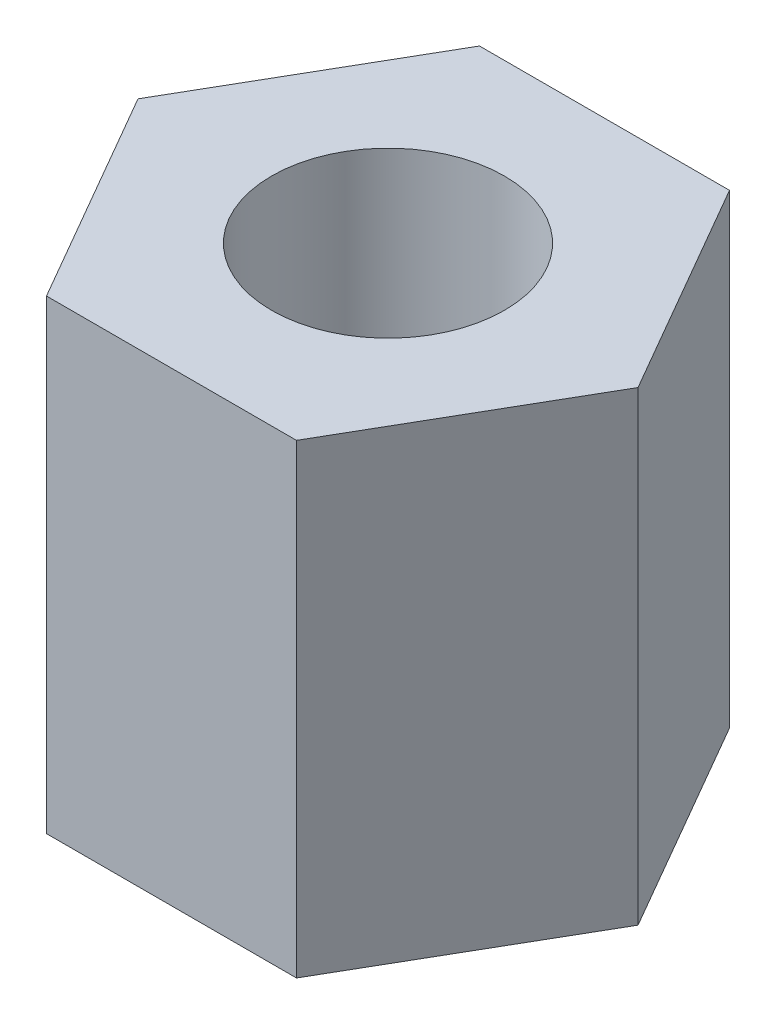
ISO-10303-21;
HEADER;
FILE_DESCRIPTION(('STEP AP214'),'2;1');
FILE_NAME('part.step','',(''),(''),'','','');
FILE_SCHEMA(('AUTOMOTIVE_DESIGN { 1 0 10303 214 1 1 1 1 }'));
ENDSEC;
DATA;
#1=APPLICATION_CONTEXT('core data for automotive mechanical design processes');
#2=APPLICATION_PROTOCOL_DEFINITION('international standard','automotive_design',2000,#1);
#3=PRODUCT_CONTEXT('',#1,'mechanical');
#4=PRODUCT('Part','Part','',(#3));
#5=PRODUCT_RELATED_PRODUCT_CATEGORY('part','',(#4));
#6=PRODUCT_DEFINITION_FORMATION('','',#4);
#7=PRODUCT_DEFINITION_CONTEXT('part definition',#1,'design');
#8=PRODUCT_DEFINITION('design','',#6,#7);
#9=PRODUCT_DEFINITION_SHAPE('','',#8);
#10=(LENGTH_UNIT() NAMED_UNIT(*) SI_UNIT(.MILLI.,.METRE.));
#11=(NAMED_UNIT(*) PLANE_ANGLE_UNIT() SI_UNIT($,.RADIAN.));
#12=(NAMED_UNIT(*) SI_UNIT($,.STERADIAN.) SOLID_ANGLE_UNIT());
#13=UNCERTAINTY_MEASURE_WITH_UNIT(LENGTH_MEASURE(1.E-05),#10,'distance_accuracy_value','');
#14=(GEOMETRIC_REPRESENTATION_CONTEXT(3) GLOBAL_UNCERTAINTY_ASSIGNED_CONTEXT((#13)) GLOBAL_UNIT_ASSIGNED_CONTEXT((#10,
#11,#12)) REPRESENTATION_CONTEXT('',''));
#15=CARTESIAN_POINT('',(0.,0.,0.));
#16=DIRECTION('',(0.,0.,1.));
#17=DIRECTION('',(1.,0.,0.));
#18=AXIS2_PLACEMENT_3D('',#15,#16,#17);
#19=CARTESIAN_POINT('',(1.34233937586591,2.5,2.32499999999999));
#20=DIRECTION('',(-0.866025403784442,0.,-0.499999999999995));
#21=DIRECTION('',(-0.499999999999995,0.,0.866025403784442));
#22=AXIS2_PLACEMENT_3D('',#19,#20,#21);
#23=PLANE('',#22);
#24=DIRECTION('',(0.499999999999995,0.,-0.866025403784442));
#25=VECTOR('',#24,1.);
#26=CARTESIAN_POINT('',(1.34233937586591,-2.5,2.32499999999999));
#27=LINE('',#26,#25);
#28=CARTESIAN_POINT('',(1.34233937586591,-2.5,2.32499999999999));
#29=VERTEX_POINT('',#28);
#30=CARTESIAN_POINT('',(2.68467875173176,-2.5,0.));
#31=VERTEX_POINT('',#30);
#32=EDGE_CURVE('E119',#29,#31,#27,.T.);
#33=ORIENTED_EDGE('',*,*,#32,.T.);
#34=DIRECTION('',(0.,-1.,0.));
#35=VECTOR('',#34,1.);
#36=CARTESIAN_POINT('',(2.68467875173176,2.5,0.));
#37=LINE('',#36,#35);
#38=CARTESIAN_POINT('',(2.68467875173176,2.5,0.));
#39=VERTEX_POINT('',#38);
#40=EDGE_CURVE('E11',#39,#31,#37,.T.);
#41=ORIENTED_EDGE('',*,*,#40,.F.);
#42=DIRECTION('',(0.499999999999995,0.,-0.866025403784442));
#43=VECTOR('',#42,1.);
#44=CARTESIAN_POINT('',(1.34233937586591,2.5,2.32499999999999));
#45=LINE('',#44,#43);
#46=CARTESIAN_POINT('',(1.34233937586591,2.5,2.32499999999999));
#47=VERTEX_POINT('',#46);
#48=EDGE_CURVE('E130',#47,#39,#45,.T.);
#49=ORIENTED_EDGE('',*,*,#48,.F.);
#50=DIRECTION('',(0.,-1.,0.));
#51=VECTOR('',#50,1.);
#52=CARTESIAN_POINT('',(1.34233937586591,2.5,2.32499999999999));
#53=LINE('',#52,#51);
#54=EDGE_CURVE('E115',#47,#29,#53,.T.);
#55=ORIENTED_EDGE('',*,*,#54,.T.);
#56=EDGE_LOOP('',(#33,#41,#49,#55));
#57=FACE_BOUND('',#56,.T.);
#58=ADVANCED_FACE('F35',(#57),#23,.F.);
#59=CARTESIAN_POINT('',(2.68467875173176,2.5,0.));
#60=DIRECTION('',(-0.866025403784438,0.,0.500000000000001));
#61=DIRECTION('',(0.500000000000001,0.,0.866025403784438));
#62=AXIS2_PLACEMENT_3D('',#59,#60,#61);
#63=PLANE('',#62);
#64=DIRECTION('',(-0.500000000000001,0.,-0.866025403784438));
#65=VECTOR('',#64,1.);
#66=CARTESIAN_POINT('',(2.68467875173176,-2.5,0.));
#67=LINE('',#66,#65);
#68=CARTESIAN_POINT('',(1.34233937586588,-2.5,-2.325));
#69=VERTEX_POINT('',#68);
#70=EDGE_CURVE('E122',#31,#69,#67,.T.);
#71=ORIENTED_EDGE('',*,*,#70,.T.);
#72=DIRECTION('',(0.,-1.,0.));
#73=VECTOR('',#72,1.);
#74=CARTESIAN_POINT('',(1.34233937586588,2.5,-2.325));
#75=LINE('',#74,#73);
#76=CARTESIAN_POINT('',(1.34233937586588,2.5,-2.325));
#77=VERTEX_POINT('',#76);
#78=EDGE_CURVE('E43',#77,#69,#75,.T.);
#79=ORIENTED_EDGE('',*,*,#78,.F.);
#80=DIRECTION('',(-0.500000000000001,0.,-0.866025403784438));
#81=VECTOR('',#80,1.);
#82=CARTESIAN_POINT('',(2.68467875173176,2.5,0.));
#83=LINE('',#82,#81);
#84=EDGE_CURVE('E88',#39,#77,#83,.T.);
#85=ORIENTED_EDGE('',*,*,#84,.F.);
#86=ORIENTED_EDGE('',*,*,#40,.T.);
#87=EDGE_LOOP('',(#71,#79,#85,#86));
#88=FACE_BOUND('',#87,.T.);
#89=ADVANCED_FACE('F155',(#88),#63,.F.);
#90=CARTESIAN_POINT('',(1.34233937586588,2.5,-2.325));
#91=DIRECTION('',(0.,0.,1.));
#92=DIRECTION('',(1.,0.,0.));
#93=AXIS2_PLACEMENT_3D('',#90,#91,#92);
#94=PLANE('',#93);
#95=DIRECTION('',(-1.,0.,0.));
#96=VECTOR('',#95,1.);
#97=CARTESIAN_POINT('',(1.34233937586588,-2.5,-2.325));
#98=LINE('',#97,#96);
#99=CARTESIAN_POINT('',(-1.34233937586589,-2.5,-2.32499999999999));
#100=VERTEX_POINT('',#99);
#101=EDGE_CURVE('E125',#69,#100,#98,.T.);
#102=ORIENTED_EDGE('',*,*,#101,.T.);
#103=DIRECTION('',(0.,-1.,0.));
#104=VECTOR('',#103,1.);
#105=CARTESIAN_POINT('',(-1.34233937586589,2.5,-2.32499999999999));
#106=LINE('',#105,#104);
#107=CARTESIAN_POINT('',(-1.34233937586589,2.5,-2.32499999999999));
#108=VERTEX_POINT('',#107);
#109=EDGE_CURVE('E110',#108,#100,#106,.T.);
#110=ORIENTED_EDGE('',*,*,#109,.F.);
#111=DIRECTION('',(-1.,0.,0.));
#112=VECTOR('',#111,1.);
#113=CARTESIAN_POINT('',(1.34233937586588,2.5,-2.325));
#114=LINE('',#113,#112);
#115=EDGE_CURVE('E101',#77,#108,#114,.T.);
#116=ORIENTED_EDGE('',*,*,#115,.F.);
#117=ORIENTED_EDGE('',*,*,#78,.T.);
#118=EDGE_LOOP('',(#102,#110,#116,#117));
#119=FACE_BOUND('',#118,.T.);
#120=ADVANCED_FACE('F136',(#119),#94,.F.);
#121=CARTESIAN_POINT('',(-1.34233937586589,2.5,-2.32499999999999));
#122=DIRECTION('',(0.866025403784441,0.,0.499999999999995));
#123=DIRECTION('',(0.499999999999995,0.,-0.866025403784441));
#124=AXIS2_PLACEMENT_3D('',#121,#122,#123);
#125=PLANE('',#124);
#126=DIRECTION('',(-0.499999999999995,0.,0.866025403784441));
#127=VECTOR('',#126,1.);
#128=CARTESIAN_POINT('',(-1.34233937586589,-2.5,-2.32499999999999));
#129=LINE('',#128,#127);
#130=CARTESIAN_POINT('',(-2.68467875173176,-2.5,0.));
#131=VERTEX_POINT('',#130);
#132=EDGE_CURVE('E109',#100,#131,#129,.T.);
#133=ORIENTED_EDGE('',*,*,#132,.T.);
#134=DIRECTION('',(0.,-1.,0.));
#135=VECTOR('',#134,1.);
#136=CARTESIAN_POINT('',(-2.68467875173176,2.5,0.));
#137=LINE('',#136,#135);
#138=CARTESIAN_POINT('',(-2.68467875173176,2.5,0.));
#139=VERTEX_POINT('',#138);
#140=EDGE_CURVE('E106',#139,#131,#137,.T.);
#141=ORIENTED_EDGE('',*,*,#140,.F.);
#142=DIRECTION('',(-0.499999999999995,0.,0.866025403784441));
#143=VECTOR('',#142,1.);
#144=CARTESIAN_POINT('',(-1.34233937586589,2.5,-2.32499999999999));
#145=LINE('',#144,#143);
#146=EDGE_CURVE('E95',#108,#139,#145,.T.);
#147=ORIENTED_EDGE('',*,*,#146,.F.);
#148=ORIENTED_EDGE('',*,*,#109,.T.);
#149=EDGE_LOOP('',(#133,#141,#147,#148));
#150=FACE_BOUND('',#149,.T.);
#151=ADVANCED_FACE('F107',(#150),#125,.F.);
#152=CARTESIAN_POINT('',(-2.68467875173176,2.5,0.));
#153=DIRECTION('',(0.866025403784434,0.,-0.500000000000007));
#154=DIRECTION('',(-0.500000000000007,0.,-0.866025403784435));
#155=AXIS2_PLACEMENT_3D('',#152,#153,#154);
#156=PLANE('',#155);
#157=DIRECTION('',(0.500000000000007,0.,0.866025403784434));
#158=VECTOR('',#157,1.);
#159=CARTESIAN_POINT('',(-2.68467875173176,-2.5,0.));
#160=LINE('',#159,#158);
#161=CARTESIAN_POINT('',(-1.34233937586586,-2.5,2.32500000000001));
#162=VERTEX_POINT('',#161);
#163=EDGE_CURVE('E74',#131,#162,#160,.T.);
#164=ORIENTED_EDGE('',*,*,#163,.T.);
#165=DIRECTION('',(0.,-1.,0.));
#166=VECTOR('',#165,1.);
#167=CARTESIAN_POINT('',(-1.34233937586586,2.5,2.32500000000001));
#168=LINE('',#167,#166);
#169=CARTESIAN_POINT('',(-1.34233937586586,2.5,2.32500000000001));
#170=VERTEX_POINT('',#169);
#171=EDGE_CURVE('E111',#170,#162,#168,.T.);
#172=ORIENTED_EDGE('',*,*,#171,.F.);
#173=DIRECTION('',(0.500000000000007,0.,0.866025403784434));
#174=VECTOR('',#173,1.);
#175=CARTESIAN_POINT('',(-2.68467875173176,2.5,0.));
#176=LINE('',#175,#174);
#177=EDGE_CURVE('E99',#139,#170,#176,.T.);
#178=ORIENTED_EDGE('',*,*,#177,.F.);
#179=ORIENTED_EDGE('',*,*,#140,.T.);
#180=EDGE_LOOP('',(#164,#172,#178,#179));
#181=FACE_BOUND('',#180,.T.);
#182=ADVANCED_FACE('F113',(#181),#156,.F.);
#183=CARTESIAN_POINT('',(-1.34233937586586,2.5,2.32500000000001));
#184=DIRECTION('',(0.,0.,-1.));
#185=DIRECTION('',(-1.,0.,0.));
#186=AXIS2_PLACEMENT_3D('',#183,#184,#185);
#187=PLANE('',#186);
#188=DIRECTION('',(1.,0.,0.));
#189=VECTOR('',#188,1.);
#190=CARTESIAN_POINT('',(-1.34233937586586,-2.5,2.32500000000001));
#191=LINE('',#190,#189);
#192=EDGE_CURVE('E80',#162,#29,#191,.T.);
#193=ORIENTED_EDGE('',*,*,#192,.T.);
#194=ORIENTED_EDGE('',*,*,#54,.F.);
#195=DIRECTION('',(1.,0.,0.));
#196=VECTOR('',#195,1.);
#197=CARTESIAN_POINT('',(-1.34233937586586,2.5,2.32500000000001));
#198=LINE('',#197,#196);
#199=EDGE_CURVE('E51',#170,#47,#198,.T.);
#200=ORIENTED_EDGE('',*,*,#199,.F.);
#201=ORIENTED_EDGE('',*,*,#171,.T.);
#202=EDGE_LOOP('',(#193,#194,#200,#201));
#203=FACE_BOUND('',#202,.T.);
#204=ADVANCED_FACE('F143',(#203),#187,.F.);
#205=CARTESIAN_POINT('',(0.,2.5,0.));
#206=DIRECTION('',(0.,1.,0.));
#207=DIRECTION('',(0.,0.,1.));
#208=AXIS2_PLACEMENT_3D('',#205,#206,#207);
#209=PLANE('',#208);
#210=CARTESIAN_POINT('',(0.,2.5,0.));
#211=DIRECTION('',(0.,1.,0.));
#212=DIRECTION('',(0.,0.,1.));
#213=AXIS2_PLACEMENT_3D('',#210,#211,#212);
#214=CIRCLE('',#213,1.24999999999999);
#215=CARTESIAN_POINT('',(0.,2.5,1.24999999999999));
#216=VERTEX_POINT('',#215);
#217=EDGE_CURVE('E123',#216,#216,#214,.T.);
#218=ORIENTED_EDGE('',*,*,#217,.F.);
#219=EDGE_LOOP('',(#218));
#220=FACE_BOUND('',#219,.T.);
#221=ORIENTED_EDGE('',*,*,#48,.T.);
#222=ORIENTED_EDGE('',*,*,#84,.T.);
#223=ORIENTED_EDGE('',*,*,#115,.T.);
#224=ORIENTED_EDGE('',*,*,#146,.T.);
#225=ORIENTED_EDGE('',*,*,#177,.T.);
#226=ORIENTED_EDGE('',*,*,#199,.T.);
#227=EDGE_LOOP('',(#221,#222,#223,#224,#225,#226));
#228=FACE_BOUND('',#227,.T.);
#229=ADVANCED_FACE('F97',(#220,#228),#209,.T.);
#230=CARTESIAN_POINT('',(0.,-2.5,0.));
#231=DIRECTION('',(0.,1.,0.));
#232=DIRECTION('',(0.,0.,1.));
#233=AXIS2_PLACEMENT_3D('',#230,#231,#232);
#234=PLANE('',#233);
#235=CARTESIAN_POINT('',(0.,-2.5,0.));
#236=DIRECTION('',(0.,-1.,0.));
#237=DIRECTION('',(0.,0.,-1.));
#238=AXIS2_PLACEMENT_3D('',#235,#236,#237);
#239=CIRCLE('',#238,1.24999999999999);
#240=CARTESIAN_POINT('',(0.,-2.5,-1.24999999999999));
#241=VERTEX_POINT('',#240);
#242=EDGE_CURVE('E212',#241,#241,#239,.T.);
#243=ORIENTED_EDGE('',*,*,#242,.F.);
#244=EDGE_LOOP('',(#243));
#245=FACE_BOUND('',#244,.T.);
#246=ORIENTED_EDGE('',*,*,#32,.F.);
#247=ORIENTED_EDGE('',*,*,#192,.F.);
#248=ORIENTED_EDGE('',*,*,#163,.F.);
#249=ORIENTED_EDGE('',*,*,#132,.F.);
#250=ORIENTED_EDGE('',*,*,#101,.F.);
#251=ORIENTED_EDGE('',*,*,#70,.F.);
#252=EDGE_LOOP('',(#246,#247,#248,#249,#250,#251));
#253=FACE_BOUND('',#252,.T.);
#254=ADVANCED_FACE('F139',(#245,#253),#234,.F.);
#255=CARTESIAN_POINT('',(0.,-2.5,0.));
#256=DIRECTION('',(0.,-1.,0.));
#257=DIRECTION('',(0.,0.,-1.));
#258=AXIS2_PLACEMENT_3D('',#255,#256,#257);
#259=CYLINDRICAL_SURFACE('',#258,1.24999999999999);
#260=ORIENTED_EDGE('',*,*,#217,.T.);
#261=EDGE_LOOP('',(#260));
#262=FACE_BOUND('',#261,.T.);
#263=ORIENTED_EDGE('',*,*,#242,.T.);
#264=EDGE_LOOP('',(#263));
#265=FACE_BOUND('',#264,.T.);
#266=ADVANCED_FACE('F192',(#262,#265),#259,.F.);
#267=CLOSED_SHELL('',(#58,#89,#120,#151,#182,#204,#229,#254,#266));
#268=MANIFOLD_SOLID_BREP('B2',#267);
#269=ADVANCED_BREP_SHAPE_REPRESENTATION('',(#18,#268),#14);
#270=SHAPE_DEFINITION_REPRESENTATION(#9,#269);
ENDSEC;
END-ISO-10303-21;
